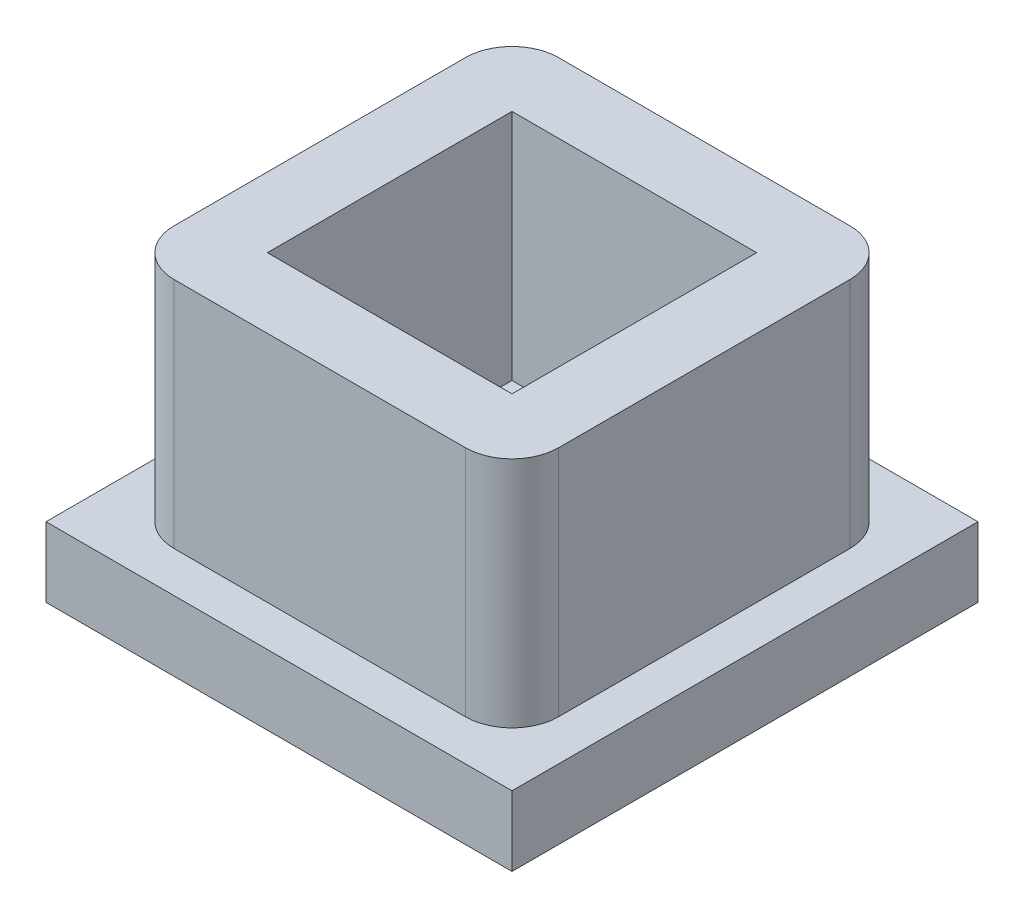
ISO-10303-21;
HEADER;
FILE_DESCRIPTION(('STEP AP214'),'2;1');
FILE_NAME('part.step','',(''),(''),'','','');
FILE_SCHEMA(('AUTOMOTIVE_DESIGN { 1 0 10303 214 1 1 1 1 }'));
ENDSEC;
DATA;
#1=APPLICATION_CONTEXT('core data for automotive mechanical design processes');
#2=APPLICATION_PROTOCOL_DEFINITION('international standard','automotive_design',2000,#1);
#3=PRODUCT_CONTEXT('',#1,'mechanical');
#4=PRODUCT('Part','Part','',(#3));
#5=PRODUCT_RELATED_PRODUCT_CATEGORY('part','',(#4));
#6=PRODUCT_DEFINITION_FORMATION('','',#4);
#7=PRODUCT_DEFINITION_CONTEXT('part definition',#1,'design');
#8=PRODUCT_DEFINITION('design','',#6,#7);
#9=PRODUCT_DEFINITION_SHAPE('','',#8);
#10=(LENGTH_UNIT() NAMED_UNIT(*) SI_UNIT(.MILLI.,.METRE.));
#11=(NAMED_UNIT(*) PLANE_ANGLE_UNIT() SI_UNIT($,.RADIAN.));
#12=(NAMED_UNIT(*) SI_UNIT($,.STERADIAN.) SOLID_ANGLE_UNIT());
#13=UNCERTAINTY_MEASURE_WITH_UNIT(LENGTH_MEASURE(1.E-05),#10,'distance_accuracy_value','');
#14=(GEOMETRIC_REPRESENTATION_CONTEXT(3) GLOBAL_UNCERTAINTY_ASSIGNED_CONTEXT((#13)) GLOBAL_UNIT_ASSIGNED_CONTEXT((#10,
#11,#12)) REPRESENTATION_CONTEXT('',''));
#15=CARTESIAN_POINT('',(0.,0.,0.));
#16=DIRECTION('',(0.,0.,1.));
#17=DIRECTION('',(1.,0.,0.));
#18=AXIS2_PLACEMENT_3D('',#15,#16,#17);
#19=CARTESIAN_POINT('',(0.,3.,0.));
#20=DIRECTION('',(0.,1.,0.));
#21=DIRECTION('',(0.,0.,1.));
#22=AXIS2_PLACEMENT_3D('',#19,#20,#21);
#23=PLANE('',#22);
#24=DIRECTION('',(0.,0.,-1.));
#25=VECTOR('',#24,1.);
#26=CARTESIAN_POINT('',(10.,3.,-10.));
#27=LINE('',#26,#25);
#28=CARTESIAN_POINT('',(10.,3.,10.));
#29=VERTEX_POINT('',#28);
#30=CARTESIAN_POINT('',(10.,3.,-10.));
#31=VERTEX_POINT('',#30);
#32=EDGE_CURVE('E239',#29,#31,#27,.T.);
#33=ORIENTED_EDGE('',*,*,#32,.T.);
#34=DIRECTION('',(-1.,0.,0.));
#35=VECTOR('',#34,1.);
#36=CARTESIAN_POINT('',(-10.,3.,-10.));
#37=LINE('',#36,#35);
#38=CARTESIAN_POINT('',(-10.,3.,-10.));
#39=VERTEX_POINT('',#38);
#40=EDGE_CURVE('E243',#31,#39,#37,.T.);
#41=ORIENTED_EDGE('',*,*,#40,.T.);
#42=DIRECTION('',(0.,0.,1.));
#43=VECTOR('',#42,1.);
#44=CARTESIAN_POINT('',(-10.,3.,-10.));
#45=LINE('',#44,#43);
#46=CARTESIAN_POINT('',(-10.,3.,10.));
#47=VERTEX_POINT('',#46);
#48=EDGE_CURVE('E247',#39,#47,#45,.T.);
#49=ORIENTED_EDGE('',*,*,#48,.T.);
#50=DIRECTION('',(1.,0.,0.));
#51=VECTOR('',#50,1.);
#52=CARTESIAN_POINT('',(-10.,3.,10.));
#53=LINE('',#52,#51);
#54=EDGE_CURVE('E250',#47,#29,#53,.T.);
#55=ORIENTED_EDGE('',*,*,#54,.T.);
#56=EDGE_LOOP('',(#33,#41,#49,#55));
#57=FACE_BOUND('',#56,.T.);
#58=DIRECTION('',(-1.,0.,0.));
#59=VECTOR('',#58,1.);
#60=CARTESIAN_POINT('',(-8.25,3.,-8.25));
#61=LINE('',#60,#59);
#62=CARTESIAN_POINT('',(6.25,3.,-8.25));
#63=VERTEX_POINT('',#62);
#64=CARTESIAN_POINT('',(-6.25,3.,-8.25));
#65=VERTEX_POINT('',#64);
#66=EDGE_CURVE('E229',#63,#65,#61,.T.);
#67=ORIENTED_EDGE('',*,*,#66,.F.);
#68=CARTESIAN_POINT('',(6.25,3.,-6.25));
#69=DIRECTION('',(0.,1.,0.));
#70=DIRECTION('',(0.,0.,1.));
#71=AXIS2_PLACEMENT_3D('',#68,#69,#70);
#72=CIRCLE('',#71,2.);
#73=CARTESIAN_POINT('',(8.25,3.,-6.25));
#74=VERTEX_POINT('',#73);
#75=EDGE_CURVE('E49',#63,#74,#72,.F.);
#76=ORIENTED_EDGE('',*,*,#75,.T.);
#77=DIRECTION('',(0.,0.,-1.));
#78=VECTOR('',#77,1.);
#79=CARTESIAN_POINT('',(8.25,3.,-8.25));
#80=LINE('',#79,#78);
#81=CARTESIAN_POINT('',(8.25,3.,6.25));
#82=VERTEX_POINT('',#81);
#83=EDGE_CURVE('E175',#82,#74,#80,.T.);
#84=ORIENTED_EDGE('',*,*,#83,.F.);
#85=CARTESIAN_POINT('',(6.25,3.,6.25));
#86=DIRECTION('',(0.,1.,0.));
#87=DIRECTION('',(0.,0.,1.));
#88=AXIS2_PLACEMENT_3D('',#85,#86,#87);
#89=CIRCLE('',#88,2.);
#90=CARTESIAN_POINT('',(6.25,3.,8.25));
#91=VERTEX_POINT('',#90);
#92=EDGE_CURVE('E322',#82,#91,#89,.F.);
#93=ORIENTED_EDGE('',*,*,#92,.T.);
#94=DIRECTION('',(1.,0.,0.));
#95=VECTOR('',#94,1.);
#96=CARTESIAN_POINT('',(-8.25,3.,8.25));
#97=LINE('',#96,#95);
#98=CARTESIAN_POINT('',(-6.25,3.,8.25));
#99=VERTEX_POINT('',#98);
#100=EDGE_CURVE('E213',#99,#91,#97,.T.);
#101=ORIENTED_EDGE('',*,*,#100,.F.);
#102=CARTESIAN_POINT('',(-6.25,3.,6.25));
#103=DIRECTION('',(0.,1.,0.));
#104=DIRECTION('',(0.,0.,1.));
#105=AXIS2_PLACEMENT_3D('',#102,#103,#104);
#106=CIRCLE('',#105,2.);
#107=CARTESIAN_POINT('',(-8.25,3.,6.25));
#108=VERTEX_POINT('',#107);
#109=EDGE_CURVE('E319',#99,#108,#106,.F.);
#110=ORIENTED_EDGE('',*,*,#109,.T.);
#111=DIRECTION('',(0.,0.,1.));
#112=VECTOR('',#111,1.);
#113=CARTESIAN_POINT('',(-8.25,3.,-8.25));
#114=LINE('',#113,#112);
#115=CARTESIAN_POINT('',(-8.25,3.,-6.25));
#116=VERTEX_POINT('',#115);
#117=EDGE_CURVE('E232',#116,#108,#114,.T.);
#118=ORIENTED_EDGE('',*,*,#117,.F.);
#119=CARTESIAN_POINT('',(-6.25,3.,-6.25));
#120=DIRECTION('',(0.,1.,0.));
#121=DIRECTION('',(0.,0.,1.));
#122=AXIS2_PLACEMENT_3D('',#119,#120,#121);
#123=CIRCLE('',#122,2.);
#124=EDGE_CURVE('E11',#116,#65,#123,.F.);
#125=ORIENTED_EDGE('',*,*,#124,.T.);
#126=EDGE_LOOP('',(#67,#76,#84,#93,#101,#110,#118,#125));
#127=FACE_BOUND('',#126,.T.);
#128=ADVANCED_FACE('F40',(#57,#127),#23,.T.);
#129=CARTESIAN_POINT('',(10.,3.,-10.));
#130=DIRECTION('',(-1.,0.,0.));
#131=DIRECTION('',(0.,0.,1.));
#132=AXIS2_PLACEMENT_3D('',#129,#130,#131);
#133=PLANE('',#132);
#134=DIRECTION('',(0.,0.,-1.));
#135=VECTOR('',#134,1.);
#136=CARTESIAN_POINT('',(10.,0.,-10.));
#137=LINE('',#136,#135);
#138=CARTESIAN_POINT('',(10.,0.,10.));
#139=VERTEX_POINT('',#138);
#140=CARTESIAN_POINT('',(10.,0.,-10.));
#141=VERTEX_POINT('',#140);
#142=EDGE_CURVE('E225',#139,#141,#137,.T.);
#143=ORIENTED_EDGE('',*,*,#142,.T.);
#144=DIRECTION('',(0.,-1.,0.));
#145=VECTOR('',#144,1.);
#146=CARTESIAN_POINT('',(10.,3.,-10.));
#147=LINE('',#146,#145);
#148=EDGE_CURVE('E276',#31,#141,#147,.T.);
#149=ORIENTED_EDGE('',*,*,#148,.F.);
#150=ORIENTED_EDGE('',*,*,#32,.F.);
#151=DIRECTION('',(0.,-1.,0.));
#152=VECTOR('',#151,1.);
#153=CARTESIAN_POINT('',(10.,3.,10.));
#154=LINE('',#153,#152);
#155=EDGE_CURVE('E253',#29,#139,#154,.T.);
#156=ORIENTED_EDGE('',*,*,#155,.T.);
#157=EDGE_LOOP('',(#143,#149,#150,#156));
#158=FACE_BOUND('',#157,.T.);
#159=ADVANCED_FACE('F365',(#158),#133,.F.);
#160=CARTESIAN_POINT('',(-10.,3.,-10.));
#161=DIRECTION('',(0.,0.,1.));
#162=DIRECTION('',(1.,0.,0.));
#163=AXIS2_PLACEMENT_3D('',#160,#161,#162);
#164=PLANE('',#163);
#165=DIRECTION('',(-1.,0.,0.));
#166=VECTOR('',#165,1.);
#167=CARTESIAN_POINT('',(-10.,0.,-10.));
#168=LINE('',#167,#166);
#169=CARTESIAN_POINT('',(-10.,0.,-10.));
#170=VERTEX_POINT('',#169);
#171=EDGE_CURVE('E257',#141,#170,#168,.T.);
#172=ORIENTED_EDGE('',*,*,#171,.T.);
#173=DIRECTION('',(0.,-1.,0.));
#174=VECTOR('',#173,1.);
#175=CARTESIAN_POINT('',(-10.,3.,-10.));
#176=LINE('',#175,#174);
#177=EDGE_CURVE('E272',#39,#170,#176,.T.);
#178=ORIENTED_EDGE('',*,*,#177,.F.);
#179=ORIENTED_EDGE('',*,*,#40,.F.);
#180=ORIENTED_EDGE('',*,*,#148,.T.);
#181=EDGE_LOOP('',(#172,#178,#179,#180));
#182=FACE_BOUND('',#181,.T.);
#183=ADVANCED_FACE('F371',(#182),#164,.F.);
#184=CARTESIAN_POINT('',(-10.,3.,-10.));
#185=DIRECTION('',(1.,0.,0.));
#186=DIRECTION('',(0.,0.,-1.));
#187=AXIS2_PLACEMENT_3D('',#184,#185,#186);
#188=PLANE('',#187);
#189=DIRECTION('',(0.,0.,1.));
#190=VECTOR('',#189,1.);
#191=CARTESIAN_POINT('',(-10.,0.,-10.));
#192=LINE('',#191,#190);
#193=CARTESIAN_POINT('',(-10.,0.,10.));
#194=VERTEX_POINT('',#193);
#195=EDGE_CURVE('E260',#170,#194,#192,.T.);
#196=ORIENTED_EDGE('',*,*,#195,.T.);
#197=DIRECTION('',(0.,-1.,0.));
#198=VECTOR('',#197,1.);
#199=CARTESIAN_POINT('',(-10.,3.,10.));
#200=LINE('',#199,#198);
#201=EDGE_CURVE('E268',#47,#194,#200,.T.);
#202=ORIENTED_EDGE('',*,*,#201,.F.);
#203=ORIENTED_EDGE('',*,*,#48,.F.);
#204=ORIENTED_EDGE('',*,*,#177,.T.);
#205=EDGE_LOOP('',(#196,#202,#203,#204));
#206=FACE_BOUND('',#205,.T.);
#207=ADVANCED_FACE('F533',(#206),#188,.F.);
#208=CARTESIAN_POINT('',(-10.,3.,10.));
#209=DIRECTION('',(0.,0.,-1.));
#210=DIRECTION('',(-1.,0.,0.));
#211=AXIS2_PLACEMENT_3D('',#208,#209,#210);
#212=PLANE('',#211);
#213=DIRECTION('',(1.,0.,0.));
#214=VECTOR('',#213,1.);
#215=CARTESIAN_POINT('',(-10.,0.,10.));
#216=LINE('',#215,#214);
#217=EDGE_CURVE('E244',#194,#139,#216,.T.);
#218=ORIENTED_EDGE('',*,*,#217,.T.);
#219=ORIENTED_EDGE('',*,*,#155,.F.);
#220=ORIENTED_EDGE('',*,*,#54,.F.);
#221=ORIENTED_EDGE('',*,*,#201,.T.);
#222=EDGE_LOOP('',(#218,#219,#220,#221));
#223=FACE_BOUND('',#222,.T.);
#224=ADVANCED_FACE('F524',(#223),#212,.F.);
#225=CARTESIAN_POINT('',(0.,0.,0.));
#226=DIRECTION('',(0.,1.,0.));
#227=DIRECTION('',(0.,0.,1.));
#228=AXIS2_PLACEMENT_3D('',#225,#226,#227);
#229=PLANE('',#228);
#230=ORIENTED_EDGE('',*,*,#142,.F.);
#231=ORIENTED_EDGE('',*,*,#217,.F.);
#232=ORIENTED_EDGE('',*,*,#195,.F.);
#233=ORIENTED_EDGE('',*,*,#171,.F.);
#234=EDGE_LOOP('',(#230,#231,#232,#233));
#235=FACE_BOUND('',#234,.T.);
#236=ADVANCED_FACE('F399',(#235),#229,.F.);
#237=CARTESIAN_POINT('',(0.,13.,0.));
#238=DIRECTION('',(0.,1.,0.));
#239=DIRECTION('',(0.,0.,1.));
#240=AXIS2_PLACEMENT_3D('',#237,#238,#239);
#241=PLANE('',#240);
#242=DIRECTION('',(0.,0.,1.));
#243=VECTOR('',#242,1.);
#244=CARTESIAN_POINT('',(-8.25,13.,-8.25));
#245=LINE('',#244,#243);
#246=CARTESIAN_POINT('',(-8.25,13.,-6.25));
#247=VERTEX_POINT('',#246);
#248=CARTESIAN_POINT('',(-8.25,13.,6.25));
#249=VERTEX_POINT('',#248);
#250=EDGE_CURVE('E217',#247,#249,#245,.T.);
#251=ORIENTED_EDGE('',*,*,#250,.T.);
#252=CARTESIAN_POINT('',(-6.25,13.,6.25));
#253=DIRECTION('',(0.,1.,0.));
#254=DIRECTION('',(0.,0.,1.));
#255=AXIS2_PLACEMENT_3D('',#252,#253,#254);
#256=CIRCLE('',#255,2.);
#257=CARTESIAN_POINT('',(-6.25,13.,8.25));
#258=VERTEX_POINT('',#257);
#259=EDGE_CURVE('E303',#249,#258,#256,.T.);
#260=ORIENTED_EDGE('',*,*,#259,.T.);
#261=DIRECTION('',(1.,0.,0.));
#262=VECTOR('',#261,1.);
#263=CARTESIAN_POINT('',(-8.25,13.,8.25));
#264=LINE('',#263,#262);
#265=CARTESIAN_POINT('',(6.25,13.,8.25));
#266=VERTEX_POINT('',#265);
#267=EDGE_CURVE('E221',#258,#266,#264,.T.);
#268=ORIENTED_EDGE('',*,*,#267,.T.);
#269=CARTESIAN_POINT('',(6.25,13.,6.25));
#270=DIRECTION('',(0.,1.,0.));
#271=DIRECTION('',(0.,0.,1.));
#272=AXIS2_PLACEMENT_3D('',#269,#270,#271);
#273=CIRCLE('',#272,2.);
#274=CARTESIAN_POINT('',(8.25,13.,6.25));
#275=VERTEX_POINT('',#274);
#276=EDGE_CURVE('E300',#266,#275,#273,.T.);
#277=ORIENTED_EDGE('',*,*,#276,.T.);
#278=DIRECTION('',(0.,0.,-1.));
#279=VECTOR('',#278,1.);
#280=CARTESIAN_POINT('',(8.25,13.,-8.25));
#281=LINE('',#280,#279);
#282=CARTESIAN_POINT('',(8.25,13.,-6.25));
#283=VERTEX_POINT('',#282);
#284=EDGE_CURVE('E208',#275,#283,#281,.T.);
#285=ORIENTED_EDGE('',*,*,#284,.T.);
#286=CARTESIAN_POINT('',(6.25,13.,-6.25));
#287=DIRECTION('',(0.,1.,0.));
#288=DIRECTION('',(0.,0.,1.));
#289=AXIS2_PLACEMENT_3D('',#286,#287,#288);
#290=CIRCLE('',#289,2.);
#291=CARTESIAN_POINT('',(6.25,13.,-8.25));
#292=VERTEX_POINT('',#291);
#293=EDGE_CURVE('E297',#283,#292,#290,.T.);
#294=ORIENTED_EDGE('',*,*,#293,.T.);
#295=DIRECTION('',(-1.,0.,0.));
#296=VECTOR('',#295,1.);
#297=CARTESIAN_POINT('',(-8.25,13.,-8.25));
#298=LINE('',#297,#296);
#299=CARTESIAN_POINT('',(-6.25,13.,-8.25));
#300=VERTEX_POINT('',#299);
#301=EDGE_CURVE('E212',#292,#300,#298,.T.);
#302=ORIENTED_EDGE('',*,*,#301,.T.);
#303=CARTESIAN_POINT('',(-6.25,13.,-6.25));
#304=DIRECTION('',(0.,1.,0.));
#305=DIRECTION('',(0.,0.,1.));
#306=AXIS2_PLACEMENT_3D('',#303,#304,#305);
#307=CIRCLE('',#306,2.);
#308=EDGE_CURVE('E294',#300,#247,#307,.T.);
#309=ORIENTED_EDGE('',*,*,#308,.T.);
#310=EDGE_LOOP('',(#251,#260,#268,#277,#285,#294,#302,#309));
#311=FACE_BOUND('',#310,.T.);
#312=DIRECTION('',(-1.,0.,0.));
#313=VECTOR('',#312,1.);
#314=CARTESIAN_POINT('',(-5.25,13.,-5.25));
#315=LINE('',#314,#313);
#316=CARTESIAN_POINT('',(5.25,13.,-5.25));
#317=VERTEX_POINT('',#316);
#318=CARTESIAN_POINT('',(-5.25,13.,-5.25));
#319=VERTEX_POINT('',#318);
#320=EDGE_CURVE('E165',#317,#319,#315,.T.);
#321=ORIENTED_EDGE('',*,*,#320,.F.);
#322=DIRECTION('',(0.,0.,-1.));
#323=VECTOR('',#322,1.);
#324=CARTESIAN_POINT('',(5.25,13.,-5.25));
#325=LINE('',#324,#323);
#326=CARTESIAN_POINT('',(5.25,13.,5.25));
#327=VERTEX_POINT('',#326);
#328=EDGE_CURVE('E154',#327,#317,#325,.T.);
#329=ORIENTED_EDGE('',*,*,#328,.F.);
#330=DIRECTION('',(1.,0.,0.));
#331=VECTOR('',#330,1.);
#332=CARTESIAN_POINT('',(-5.25,13.,5.25));
#333=LINE('',#332,#331);
#334=CARTESIAN_POINT('',(-5.25,13.,5.25));
#335=VERTEX_POINT('',#334);
#336=EDGE_CURVE('E185',#335,#327,#333,.T.);
#337=ORIENTED_EDGE('',*,*,#336,.F.);
#338=DIRECTION('',(0.,0.,1.));
#339=VECTOR('',#338,1.);
#340=CARTESIAN_POINT('',(-5.25,13.,-5.25));
#341=LINE('',#340,#339);
#342=EDGE_CURVE('E181',#319,#335,#341,.T.);
#343=ORIENTED_EDGE('',*,*,#342,.F.);
#344=EDGE_LOOP('',(#321,#329,#337,#343));
#345=FACE_BOUND('',#344,.T.);
#346=ADVANCED_FACE('F179',(#311,#345),#241,.T.);
#347=CARTESIAN_POINT('',(8.25,13.,-8.25));
#348=DIRECTION('',(-1.,0.,0.));
#349=DIRECTION('',(0.,0.,1.));
#350=AXIS2_PLACEMENT_3D('',#347,#348,#349);
#351=PLANE('',#350);
#352=ORIENTED_EDGE('',*,*,#284,.F.);
#353=DIRECTION('',(0.,-1.,0.));
#354=VECTOR('',#353,1.);
#355=CARTESIAN_POINT('',(8.25,13.,6.25));
#356=LINE('',#355,#354);
#357=EDGE_CURVE('E309',#275,#82,#356,.T.);
#358=ORIENTED_EDGE('',*,*,#357,.T.);
#359=ORIENTED_EDGE('',*,*,#83,.T.);
#360=DIRECTION('',(0.,-1.,0.));
#361=VECTOR('',#360,1.);
#362=CARTESIAN_POINT('',(8.25,13.,-6.25));
#363=LINE('',#362,#361);
#364=EDGE_CURVE('E306',#74,#283,#363,.F.);
#365=ORIENTED_EDGE('',*,*,#364,.T.);
#366=EDGE_LOOP('',(#352,#358,#359,#365));
#367=FACE_BOUND('',#366,.T.);
#368=ADVANCED_FACE('F328',(#367),#351,.F.);
#369=CARTESIAN_POINT('',(-8.25,13.,-8.25));
#370=DIRECTION('',(0.,0.,1.));
#371=DIRECTION('',(1.,0.,0.));
#372=AXIS2_PLACEMENT_3D('',#369,#370,#371);
#373=PLANE('',#372);
#374=ORIENTED_EDGE('',*,*,#301,.F.);
#375=DIRECTION('',(0.,-1.,0.));
#376=VECTOR('',#375,1.);
#377=CARTESIAN_POINT('',(6.25,13.,-8.25));
#378=LINE('',#377,#376);
#379=EDGE_CURVE('E316',#292,#63,#378,.T.);
#380=ORIENTED_EDGE('',*,*,#379,.T.);
#381=ORIENTED_EDGE('',*,*,#66,.T.);
#382=DIRECTION('',(0.,-1.,0.));
#383=VECTOR('',#382,1.);
#384=CARTESIAN_POINT('',(-6.25,13.,-8.25));
#385=LINE('',#384,#383);
#386=EDGE_CURVE('E313',#65,#300,#385,.F.);
#387=ORIENTED_EDGE('',*,*,#386,.T.);
#388=EDGE_LOOP('',(#374,#380,#381,#387));
#389=FACE_BOUND('',#388,.T.);
#390=ADVANCED_FACE('F336',(#389),#373,.F.);
#391=CARTESIAN_POINT('',(-8.25,13.,-8.25));
#392=DIRECTION('',(1.,0.,0.));
#393=DIRECTION('',(0.,0.,-1.));
#394=AXIS2_PLACEMENT_3D('',#391,#392,#393);
#395=PLANE('',#394);
#396=ORIENTED_EDGE('',*,*,#117,.T.);
#397=DIRECTION('',(0.,-1.,0.));
#398=VECTOR('',#397,1.);
#399=CARTESIAN_POINT('',(-8.25,13.,6.25));
#400=LINE('',#399,#398);
#401=EDGE_CURVE('E291',#108,#249,#400,.F.);
#402=ORIENTED_EDGE('',*,*,#401,.T.);
#403=ORIENTED_EDGE('',*,*,#250,.F.);
#404=DIRECTION('',(0.,-1.,0.));
#405=VECTOR('',#404,1.);
#406=CARTESIAN_POINT('',(-8.25,13.,-6.25));
#407=LINE('',#406,#405);
#408=EDGE_CURVE('E287',#247,#116,#407,.T.);
#409=ORIENTED_EDGE('',*,*,#408,.T.);
#410=EDGE_LOOP('',(#396,#402,#403,#409));
#411=FACE_BOUND('',#410,.T.);
#412=ADVANCED_FACE('F343',(#411),#395,.F.);
#413=CARTESIAN_POINT('',(-8.25,13.,8.25));
#414=DIRECTION('',(0.,0.,-1.));
#415=DIRECTION('',(-1.,0.,0.));
#416=AXIS2_PLACEMENT_3D('',#413,#414,#415);
#417=PLANE('',#416);
#418=ORIENTED_EDGE('',*,*,#267,.F.);
#419=DIRECTION('',(0.,-1.,0.));
#420=VECTOR('',#419,1.);
#421=CARTESIAN_POINT('',(-6.25,13.,8.25));
#422=LINE('',#421,#420);
#423=EDGE_CURVE('E283',#258,#99,#422,.T.);
#424=ORIENTED_EDGE('',*,*,#423,.T.);
#425=ORIENTED_EDGE('',*,*,#100,.T.);
#426=DIRECTION('',(0.,-1.,0.));
#427=VECTOR('',#426,1.);
#428=CARTESIAN_POINT('',(6.25,13.,8.25));
#429=LINE('',#428,#427);
#430=EDGE_CURVE('E280',#91,#266,#429,.F.);
#431=ORIENTED_EDGE('',*,*,#430,.T.);
#432=EDGE_LOOP('',(#418,#424,#425,#431));
#433=FACE_BOUND('',#432,.T.);
#434=ADVANCED_FACE('F351',(#433),#417,.F.);
#435=CARTESIAN_POINT('',(5.25,13.,-5.25));
#436=DIRECTION('',(-1.,0.,0.));
#437=DIRECTION('',(0.,0.,1.));
#438=AXIS2_PLACEMENT_3D('',#435,#436,#437);
#439=PLANE('',#438);
#440=DIRECTION('',(0.,0.,-1.));
#441=VECTOR('',#440,1.);
#442=CARTESIAN_POINT('',(5.25,3.,-5.25));
#443=LINE('',#442,#441);
#444=CARTESIAN_POINT('',(5.25,3.,5.25));
#445=VERTEX_POINT('',#444);
#446=CARTESIAN_POINT('',(5.25,3.,-5.25));
#447=VERTEX_POINT('',#446);
#448=EDGE_CURVE('E190',#445,#447,#443,.T.);
#449=ORIENTED_EDGE('',*,*,#448,.F.);
#450=DIRECTION('',(0.,-1.,0.));
#451=VECTOR('',#450,1.);
#452=CARTESIAN_POINT('',(5.25,13.,5.25));
#453=LINE('',#452,#451);
#454=EDGE_CURVE('E160',#327,#445,#453,.T.);
#455=ORIENTED_EDGE('',*,*,#454,.F.);
#456=ORIENTED_EDGE('',*,*,#328,.T.);
#457=DIRECTION('',(0.,-1.,0.));
#458=VECTOR('',#457,1.);
#459=CARTESIAN_POINT('',(5.25,13.,-5.25));
#460=LINE('',#459,#458);
#461=EDGE_CURVE('E158',#317,#447,#460,.T.);
#462=ORIENTED_EDGE('',*,*,#461,.T.);
#463=EDGE_LOOP('',(#449,#455,#456,#462));
#464=FACE_BOUND('',#463,.T.);
#465=ADVANCED_FACE('F157',(#464),#439,.T.);
#466=CARTESIAN_POINT('',(-5.25,13.,-5.25));
#467=DIRECTION('',(0.,0.,1.));
#468=DIRECTION('',(1.,0.,0.));
#469=AXIS2_PLACEMENT_3D('',#466,#467,#468);
#470=PLANE('',#469);
#471=DIRECTION('',(-1.,0.,0.));
#472=VECTOR('',#471,1.);
#473=CARTESIAN_POINT('',(-5.25,3.,-5.25));
#474=LINE('',#473,#472);
#475=CARTESIAN_POINT('',(-5.25,3.,-5.25));
#476=VERTEX_POINT('',#475);
#477=EDGE_CURVE('E173',#447,#476,#474,.T.);
#478=ORIENTED_EDGE('',*,*,#477,.F.);
#479=ORIENTED_EDGE('',*,*,#461,.F.);
#480=ORIENTED_EDGE('',*,*,#320,.T.);
#481=DIRECTION('',(0.,-1.,0.));
#482=VECTOR('',#481,1.);
#483=CARTESIAN_POINT('',(-5.25,13.,-5.25));
#484=LINE('',#483,#482);
#485=EDGE_CURVE('E176',#319,#476,#484,.T.);
#486=ORIENTED_EDGE('',*,*,#485,.T.);
#487=EDGE_LOOP('',(#478,#479,#480,#486));
#488=FACE_BOUND('',#487,.T.);
#489=ADVANCED_FACE('F170',(#488),#470,.T.);
#490=CARTESIAN_POINT('',(-5.25,13.,-5.25));
#491=DIRECTION('',(1.,0.,0.));
#492=DIRECTION('',(0.,0.,-1.));
#493=AXIS2_PLACEMENT_3D('',#490,#491,#492);
#494=PLANE('',#493);
#495=DIRECTION('',(0.,0.,1.));
#496=VECTOR('',#495,1.);
#497=CARTESIAN_POINT('',(-5.25,3.,-5.25));
#498=LINE('',#497,#496);
#499=CARTESIAN_POINT('',(-5.25,3.,5.25));
#500=VERTEX_POINT('',#499);
#501=EDGE_CURVE('E195',#476,#500,#498,.T.);
#502=ORIENTED_EDGE('',*,*,#501,.F.);
#503=ORIENTED_EDGE('',*,*,#485,.F.);
#504=ORIENTED_EDGE('',*,*,#342,.T.);
#505=DIRECTION('',(0.,-1.,0.));
#506=VECTOR('',#505,1.);
#507=CARTESIAN_POINT('',(-5.25,13.,5.25));
#508=LINE('',#507,#506);
#509=EDGE_CURVE('E202',#335,#500,#508,.T.);
#510=ORIENTED_EDGE('',*,*,#509,.T.);
#511=EDGE_LOOP('',(#502,#503,#504,#510));
#512=FACE_BOUND('',#511,.T.);
#513=ADVANCED_FACE('F382',(#512),#494,.T.);
#514=CARTESIAN_POINT('',(-5.25,13.,5.25));
#515=DIRECTION('',(0.,0.,-1.));
#516=DIRECTION('',(-1.,0.,0.));
#517=AXIS2_PLACEMENT_3D('',#514,#515,#516);
#518=PLANE('',#517);
#519=DIRECTION('',(1.,0.,0.));
#520=VECTOR('',#519,1.);
#521=CARTESIAN_POINT('',(-5.25,3.,5.25));
#522=LINE('',#521,#520);
#523=EDGE_CURVE('E166',#500,#445,#522,.T.);
#524=ORIENTED_EDGE('',*,*,#523,.F.);
#525=ORIENTED_EDGE('',*,*,#509,.F.);
#526=ORIENTED_EDGE('',*,*,#336,.T.);
#527=ORIENTED_EDGE('',*,*,#454,.T.);
#528=EDGE_LOOP('',(#524,#525,#526,#527));
#529=FACE_BOUND('',#528,.T.);
#530=ADVANCED_FACE('F377',(#529),#518,.T.);
#531=ORIENTED_EDGE('',*,*,#448,.T.);
#532=ORIENTED_EDGE('',*,*,#477,.T.);
#533=ORIENTED_EDGE('',*,*,#501,.T.);
#534=ORIENTED_EDGE('',*,*,#523,.T.);
#535=EDGE_LOOP('',(#531,#532,#533,#534));
#536=FACE_BOUND('',#535,.T.);
#537=ADVANCED_FACE('F362',(#536),#23,.T.);
#538=CARTESIAN_POINT('',(-6.25,13.,6.25));
#539=DIRECTION('',(0.,-1.,0.));
#540=DIRECTION('',(0.,0.,-1.));
#541=AXIS2_PLACEMENT_3D('',#538,#539,#540);
#542=CYLINDRICAL_SURFACE('',#541,2.);
#543=ORIENTED_EDGE('',*,*,#259,.F.);
#544=ORIENTED_EDGE('',*,*,#401,.F.);
#545=ORIENTED_EDGE('',*,*,#109,.F.);
#546=ORIENTED_EDGE('',*,*,#423,.F.);
#547=EDGE_LOOP('',(#543,#544,#545,#546));
#548=FACE_BOUND('',#547,.T.);
#549=ADVANCED_FACE('F346',(#548),#542,.T.);
#550=CARTESIAN_POINT('',(6.25,13.,6.25));
#551=DIRECTION('',(0.,-1.,0.));
#552=DIRECTION('',(0.,0.,-1.));
#553=AXIS2_PLACEMENT_3D('',#550,#551,#552);
#554=CYLINDRICAL_SURFACE('',#553,2.);
#555=ORIENTED_EDGE('',*,*,#276,.F.);
#556=ORIENTED_EDGE('',*,*,#430,.F.);
#557=ORIENTED_EDGE('',*,*,#92,.F.);
#558=ORIENTED_EDGE('',*,*,#357,.F.);
#559=EDGE_LOOP('',(#555,#556,#557,#558));
#560=FACE_BOUND('',#559,.T.);
#561=ADVANCED_FACE('F355',(#560),#554,.T.);
#562=CARTESIAN_POINT('',(6.25,13.,-6.25));
#563=DIRECTION('',(0.,-1.,0.));
#564=DIRECTION('',(0.,0.,-1.));
#565=AXIS2_PLACEMENT_3D('',#562,#563,#564);
#566=CYLINDRICAL_SURFACE('',#565,2.);
#567=ORIENTED_EDGE('',*,*,#293,.F.);
#568=ORIENTED_EDGE('',*,*,#364,.F.);
#569=ORIENTED_EDGE('',*,*,#75,.F.);
#570=ORIENTED_EDGE('',*,*,#379,.F.);
#571=EDGE_LOOP('',(#567,#568,#569,#570));
#572=FACE_BOUND('',#571,.T.);
#573=ADVANCED_FACE('F331',(#572),#566,.T.);
#574=CARTESIAN_POINT('',(-6.25,13.,-6.25));
#575=DIRECTION('',(0.,-1.,0.));
#576=DIRECTION('',(0.,0.,-1.));
#577=AXIS2_PLACEMENT_3D('',#574,#575,#576);
#578=CYLINDRICAL_SURFACE('',#577,2.);
#579=ORIENTED_EDGE('',*,*,#308,.F.);
#580=ORIENTED_EDGE('',*,*,#386,.F.);
#581=ORIENTED_EDGE('',*,*,#124,.F.);
#582=ORIENTED_EDGE('',*,*,#408,.F.);
#583=EDGE_LOOP('',(#579,#580,#581,#582));
#584=FACE_BOUND('',#583,.T.);
#585=ADVANCED_FACE('F42',(#584),#578,.T.);
#586=CLOSED_SHELL('',(#128,#159,#183,#207,#224,#236,#346,#368,#390,#412,#434,#465,#489,#513,
#530,#537,#549,#561,#573,#585));
#587=MANIFOLD_SOLID_BREP('B2',#586);
#588=ADVANCED_BREP_SHAPE_REPRESENTATION('',(#18,#587),#14);
#589=SHAPE_DEFINITION_REPRESENTATION(#9,#588);
ENDSEC;
END-ISO-10303-21;
